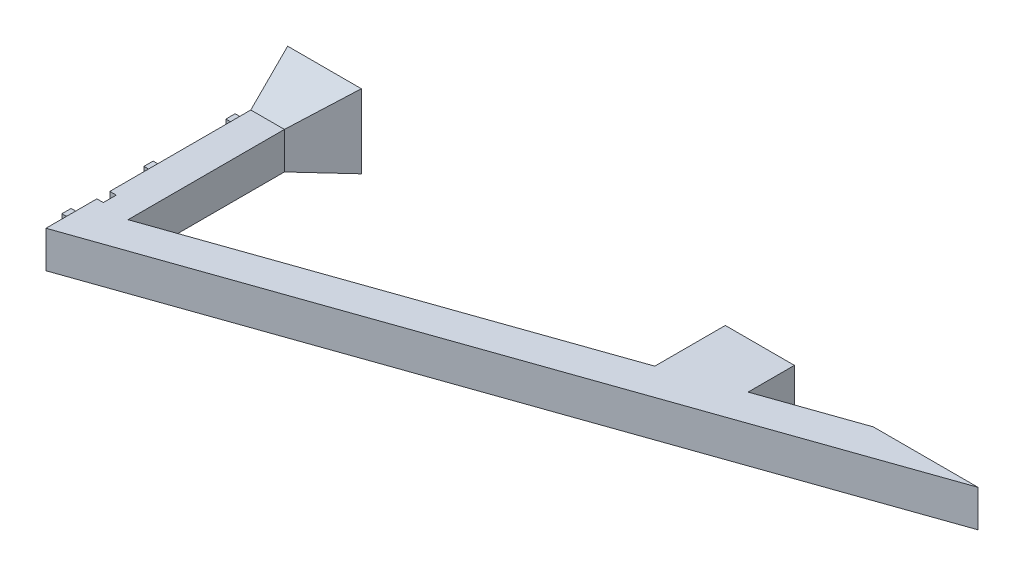
ISO-10303-21;
HEADER;
FILE_DESCRIPTION(('STEP AP214'),'2;1');
FILE_NAME('part.step','',(''),(''),'','','');
FILE_SCHEMA(('AUTOMOTIVE_DESIGN { 1 0 10303 214 1 1 1 1 }'));
ENDSEC;
DATA;
#1=APPLICATION_CONTEXT('core data for automotive mechanical design processes');
#2=APPLICATION_PROTOCOL_DEFINITION('international standard','automotive_design',2000,#1);
#3=PRODUCT_CONTEXT('',#1,'mechanical');
#4=PRODUCT('Part','Part','',(#3));
#5=PRODUCT_RELATED_PRODUCT_CATEGORY('part','',(#4));
#6=PRODUCT_DEFINITION_FORMATION('','',#4);
#7=PRODUCT_DEFINITION_CONTEXT('part definition',#1,'design');
#8=PRODUCT_DEFINITION('design','',#6,#7);
#9=PRODUCT_DEFINITION_SHAPE('','',#8);
#10=(LENGTH_UNIT() NAMED_UNIT(*) SI_UNIT(.MILLI.,.METRE.));
#11=(NAMED_UNIT(*) PLANE_ANGLE_UNIT() SI_UNIT($,.RADIAN.));
#12=(NAMED_UNIT(*) SI_UNIT($,.STERADIAN.) SOLID_ANGLE_UNIT());
#13=UNCERTAINTY_MEASURE_WITH_UNIT(LENGTH_MEASURE(1.E-05),#10,'distance_accuracy_value','');
#14=(GEOMETRIC_REPRESENTATION_CONTEXT(3) GLOBAL_UNCERTAINTY_ASSIGNED_CONTEXT((#13)) GLOBAL_UNIT_ASSIGNED_CONTEXT((#10,
#11,#12)) REPRESENTATION_CONTEXT('',''));
#15=CARTESIAN_POINT('',(0.,0.,0.));
#16=DIRECTION('',(0.,0.,1.));
#17=DIRECTION('',(1.,0.,0.));
#18=AXIS2_PLACEMENT_3D('',#15,#16,#17);
#19=CARTESIAN_POINT('',(7.3,8.,44.9487293378726));
#20=DIRECTION('',(-1.,0.,0.));
#21=DIRECTION('',(0.,0.,1.));
#22=AXIS2_PLACEMENT_3D('',#19,#20,#21);
#23=PLANE('',#22);
#24=DIRECTION('',(0.,0.,-1.));
#25=VECTOR('',#24,1.);
#26=CARTESIAN_POINT('',(7.3,8.,44.9487293378726));
#27=LINE('',#26,#25);
#28=CARTESIAN_POINT('',(7.3,8.,3.));
#29=VERTEX_POINT('',#28);
#30=CARTESIAN_POINT('',(7.3,8.,0.));
#31=VERTEX_POINT('',#30);
#32=EDGE_CURVE('E416',#29,#31,#27,.T.);
#33=ORIENTED_EDGE('',*,*,#32,.F.);
#34=DIRECTION('',(0.,-1.,0.));
#35=VECTOR('',#34,1.);
#36=CARTESIAN_POINT('',(7.3,8.,3.));
#37=LINE('',#36,#35);
#38=CARTESIAN_POINT('',(7.3,0.,3.));
#39=VERTEX_POINT('',#38);
#40=EDGE_CURVE('E266',#29,#39,#37,.T.);
#41=ORIENTED_EDGE('',*,*,#40,.T.);
#42=DIRECTION('',(0.,0.,-1.));
#43=VECTOR('',#42,1.);
#44=CARTESIAN_POINT('',(7.3,0.,44.9487293378726));
#45=LINE('',#44,#43);
#46=CARTESIAN_POINT('',(7.3,0.,0.));
#47=VERTEX_POINT('',#46);
#48=EDGE_CURVE('E255',#39,#47,#45,.T.);
#49=ORIENTED_EDGE('',*,*,#48,.T.);
#50=DIRECTION('',(0.,-1.,0.));
#51=VECTOR('',#50,1.);
#52=CARTESIAN_POINT('',(7.3,8.,0.));
#53=LINE('',#52,#51);
#54=EDGE_CURVE('E420',#31,#47,#53,.T.);
#55=ORIENTED_EDGE('',*,*,#54,.F.);
#56=EDGE_LOOP('',(#33,#41,#49,#55));
#57=FACE_BOUND('',#56,.T.);
#58=ADVANCED_FACE('F33',(#57),#23,.F.);
#59=CARTESIAN_POINT('',(0.,8.,0.));
#60=DIRECTION('',(0.,1.,0.));
#61=DIRECTION('',(0.,0.,1.));
#62=AXIS2_PLACEMENT_3D('',#59,#60,#61);
#63=PLANE('',#62);
#64=DIRECTION('',(-1.,0.,0.));
#65=VECTOR('',#64,1.);
#66=CARTESIAN_POINT('',(0.,8.,3.));
#67=LINE('',#66,#65);
#68=CARTESIAN_POINT('',(0.,8.,3.));
#69=VERTEX_POINT('',#68);
#70=EDGE_CURVE('E52',#29,#69,#67,.T.);
#71=ORIENTED_EDGE('',*,*,#70,.F.);
#72=ORIENTED_EDGE('',*,*,#32,.T.);
#73=DIRECTION('',(-1.,0.,0.));
#74=VECTOR('',#73,1.);
#75=CARTESIAN_POINT('',(7.3,8.,0.));
#76=LINE('',#75,#74);
#77=CARTESIAN_POINT('',(0.,8.,0.));
#78=VERTEX_POINT('',#77);
#79=EDGE_CURVE('E396',#31,#78,#76,.T.);
#80=ORIENTED_EDGE('',*,*,#79,.T.);
#81=DIRECTION('',(0.,0.,1.));
#82=VECTOR('',#81,1.);
#83=CARTESIAN_POINT('',(0.,8.,0.));
#84=LINE('',#83,#82);
#85=EDGE_CURVE('E48',#78,#69,#84,.T.);
#86=ORIENTED_EDGE('',*,*,#85,.T.);
#87=EDGE_LOOP('',(#71,#72,#80,#86));
#88=FACE_BOUND('',#87,.T.);
#89=ADVANCED_FACE('F520',(#88),#63,.T.);
#90=CARTESIAN_POINT('',(0.,8.,0.));
#91=DIRECTION('',(1.,0.,0.));
#92=DIRECTION('',(0.,0.,-1.));
#93=AXIS2_PLACEMENT_3D('',#90,#91,#92);
#94=PLANE('',#93);
#95=DIRECTION('',(0.,-1.,0.));
#96=VECTOR('',#95,1.);
#97=CARTESIAN_POINT('',(0.,5.,10.4));
#98=LINE('',#97,#96);
#99=CARTESIAN_POINT('',(0.,5.,10.4));
#100=VERTEX_POINT('',#99);
#101=CARTESIAN_POINT('',(0.,3.,10.4));
#102=VERTEX_POINT('',#101);
#103=EDGE_CURVE('E334',#100,#102,#98,.T.);
#104=ORIENTED_EDGE('',*,*,#103,.F.);
#105=DIRECTION('',(0.,0.,-1.));
#106=VECTOR('',#105,1.);
#107=CARTESIAN_POINT('',(0.,5.,10.4));
#108=LINE('',#107,#106);
#109=CARTESIAN_POINT('',(0.,5.,12.4));
#110=VERTEX_POINT('',#109);
#111=EDGE_CURVE('E339',#110,#100,#108,.T.);
#112=ORIENTED_EDGE('',*,*,#111,.F.);
#113=DIRECTION('',(0.,1.,0.));
#114=VECTOR('',#113,1.);
#115=CARTESIAN_POINT('',(0.,5.,12.4));
#116=LINE('',#115,#114);
#117=CARTESIAN_POINT('',(0.,3.,12.4));
#118=VERTEX_POINT('',#117);
#119=EDGE_CURVE('E350',#118,#110,#116,.T.);
#120=ORIENTED_EDGE('',*,*,#119,.F.);
#121=DIRECTION('',(0.,0.,1.));
#122=VECTOR('',#121,1.);
#123=CARTESIAN_POINT('',(0.,3.,10.4));
#124=LINE('',#123,#122);
#125=EDGE_CURVE('E348',#102,#118,#124,.T.);
#126=ORIENTED_EDGE('',*,*,#125,.F.);
#127=EDGE_LOOP('',(#104,#112,#120,#126));
#128=FACE_BOUND('',#127,.T.);
#129=DIRECTION('',(0.,-1.,0.));
#130=VECTOR('',#129,1.);
#131=CARTESIAN_POINT('',(0.,5.,28.2));
#132=LINE('',#131,#130);
#133=CARTESIAN_POINT('',(0.,5.,28.2));
#134=VERTEX_POINT('',#133);
#135=CARTESIAN_POINT('',(0.,3.,28.2));
#136=VERTEX_POINT('',#135);
#137=EDGE_CURVE('E301',#134,#136,#132,.T.);
#138=ORIENTED_EDGE('',*,*,#137,.F.);
#139=DIRECTION('',(0.,0.,-1.));
#140=VECTOR('',#139,1.);
#141=CARTESIAN_POINT('',(0.,5.,28.2));
#142=LINE('',#141,#140);
#143=CARTESIAN_POINT('',(0.,5.,30.2));
#144=VERTEX_POINT('',#143);
#145=EDGE_CURVE('E306',#144,#134,#142,.T.);
#146=ORIENTED_EDGE('',*,*,#145,.F.);
#147=DIRECTION('',(0.,1.,0.));
#148=VECTOR('',#147,1.);
#149=CARTESIAN_POINT('',(0.,5.,30.2));
#150=LINE('',#149,#148);
#151=CARTESIAN_POINT('',(0.,3.,30.2));
#152=VERTEX_POINT('',#151);
#153=EDGE_CURVE('E318',#152,#144,#150,.T.);
#154=ORIENTED_EDGE('',*,*,#153,.F.);
#155=DIRECTION('',(0.,0.,1.));
#156=VECTOR('',#155,1.);
#157=CARTESIAN_POINT('',(0.,3.,28.2));
#158=LINE('',#157,#156);
#159=EDGE_CURVE('E315',#136,#152,#158,.T.);
#160=ORIENTED_EDGE('',*,*,#159,.F.);
#161=EDGE_LOOP('',(#138,#146,#154,#160));
#162=FACE_BOUND('',#161,.T.);
#163=CARTESIAN_POINT('',(0.,8.,11.));
#164=VERTEX_POINT('',#163);
#165=CARTESIAN_POINT('',(0.,8.,41.6));
#166=VERTEX_POINT('',#165);
#167=EDGE_CURVE('E402',#164,#166,#84,.T.);
#168=ORIENTED_EDGE('',*,*,#167,.F.);
#169=DIRECTION('',(0.,-0.707106781186548,0.707106781186548));
#170=VECTOR('',#169,1.);
#171=CARTESIAN_POINT('',(0.,8.,11.));
#172=LINE('',#171,#170);
#173=CARTESIAN_POINT('',(0.,16.,3.));
#174=VERTEX_POINT('',#173);
#175=EDGE_CURVE('E240',#174,#164,#172,.T.);
#176=ORIENTED_EDGE('',*,*,#175,.F.);
#177=DIRECTION('',(0.,1.,0.));
#178=VECTOR('',#177,1.);
#179=CARTESIAN_POINT('',(0.,0.,3.));
#180=LINE('',#179,#178);
#181=EDGE_CURVE('E250',#69,#174,#180,.T.);
#182=ORIENTED_EDGE('',*,*,#181,.F.);
#183=ORIENTED_EDGE('',*,*,#85,.F.);
#184=DIRECTION('',(0.,-1.,0.));
#185=VECTOR('',#184,1.);
#186=CARTESIAN_POINT('',(0.,8.,0.));
#187=LINE('',#186,#185);
#188=CARTESIAN_POINT('',(0.,0.,0.));
#189=VERTEX_POINT('',#188);
#190=EDGE_CURVE('E41',#78,#189,#187,.T.);
#191=ORIENTED_EDGE('',*,*,#190,.T.);
#192=DIRECTION('',(0.,0.,1.));
#193=VECTOR('',#192,1.);
#194=CARTESIAN_POINT('',(0.,0.,0.));
#195=LINE('',#194,#193);
#196=CARTESIAN_POINT('',(0.,0.,55.45));
#197=VERTEX_POINT('',#196);
#198=EDGE_CURVE('E423',#189,#197,#195,.T.);
#199=ORIENTED_EDGE('',*,*,#198,.T.);
#200=DIRECTION('',(0.,-1.,0.));
#201=VECTOR('',#200,1.);
#202=CARTESIAN_POINT('',(0.,8.,55.45));
#203=LINE('',#202,#201);
#204=CARTESIAN_POINT('',(0.,8.,55.45));
#205=VERTEX_POINT('',#204);
#206=EDGE_CURVE('E463',#205,#197,#203,.T.);
#207=ORIENTED_EDGE('',*,*,#206,.F.);
#208=CARTESIAN_POINT('',(0.,8.,44.4));
#209=VERTEX_POINT('',#208);
#210=EDGE_CURVE('E398',#209,#205,#84,.T.);
#211=ORIENTED_EDGE('',*,*,#210,.F.);
#212=DIRECTION('',(0.,1.,0.));
#213=VECTOR('',#212,1.);
#214=CARTESIAN_POINT('',(0.,3.6,44.4));
#215=LINE('',#214,#213);
#216=CARTESIAN_POINT('',(0.,3.6,44.4));
#217=VERTEX_POINT('',#216);
#218=EDGE_CURVE('E379',#217,#209,#215,.T.);
#219=ORIENTED_EDGE('',*,*,#218,.F.);
#220=DIRECTION('',(0.,0.,1.));
#221=VECTOR('',#220,1.);
#222=CARTESIAN_POINT('',(0.,3.6,41.6));
#223=LINE('',#222,#221);
#224=CARTESIAN_POINT('',(0.,3.6,41.6));
#225=VERTEX_POINT('',#224);
#226=EDGE_CURVE('E366',#225,#217,#223,.T.);
#227=ORIENTED_EDGE('',*,*,#226,.F.);
#228=DIRECTION('',(0.,1.,0.));
#229=VECTOR('',#228,1.);
#230=CARTESIAN_POINT('',(0.,3.6,41.6));
#231=LINE('',#230,#229);
#232=EDGE_CURVE('E387',#225,#166,#231,.T.);
#233=ORIENTED_EDGE('',*,*,#232,.T.);
#234=EDGE_LOOP('',(#168,#176,#182,#183,#191,#199,#207,#211,#219,#227,#233));
#235=FACE_BOUND('',#234,.T.);
#236=DIRECTION('',(0.,-1.,0.));
#237=VECTOR('',#236,1.);
#238=CARTESIAN_POINT('',(0.,5.,46.));
#239=LINE('',#238,#237);
#240=CARTESIAN_POINT('',(0.,5.,46.));
#241=VERTEX_POINT('',#240);
#242=CARTESIAN_POINT('',(0.,3.,46.));
#243=VERTEX_POINT('',#242);
#244=EDGE_CURVE('E268',#241,#243,#239,.T.);
#245=ORIENTED_EDGE('',*,*,#244,.F.);
#246=DIRECTION('',(0.,0.,-1.));
#247=VECTOR('',#246,1.);
#248=CARTESIAN_POINT('',(0.,5.,46.));
#249=LINE('',#248,#247);
#250=CARTESIAN_POINT('',(0.,5.,48.));
#251=VERTEX_POINT('',#250);
#252=EDGE_CURVE('E273',#251,#241,#249,.T.);
#253=ORIENTED_EDGE('',*,*,#252,.F.);
#254=DIRECTION('',(0.,1.,0.));
#255=VECTOR('',#254,1.);
#256=CARTESIAN_POINT('',(0.,5.,48.));
#257=LINE('',#256,#255);
#258=CARTESIAN_POINT('',(0.,3.,48.));
#259=VERTEX_POINT('',#258);
#260=EDGE_CURVE('E285',#259,#251,#257,.T.);
#261=ORIENTED_EDGE('',*,*,#260,.F.);
#262=DIRECTION('',(0.,0.,1.));
#263=VECTOR('',#262,1.);
#264=CARTESIAN_POINT('',(0.,3.,46.));
#265=LINE('',#264,#263);
#266=EDGE_CURVE('E282',#243,#259,#265,.T.);
#267=ORIENTED_EDGE('',*,*,#266,.F.);
#268=EDGE_LOOP('',(#245,#253,#261,#267));
#269=FACE_BOUND('',#268,.T.);
#270=ADVANCED_FACE('F469',(#128,#162,#235,#269),#94,.F.);
#271=CARTESIAN_POINT('',(7.3,8.,0.));
#272=DIRECTION('',(0.,0.,1.));
#273=DIRECTION('',(1.,0.,0.));
#274=AXIS2_PLACEMENT_3D('',#271,#272,#273);
#275=PLANE('',#274);
#276=DIRECTION('',(-1.,0.,0.));
#277=VECTOR('',#276,1.);
#278=CARTESIAN_POINT('',(7.3,0.,0.));
#279=LINE('',#278,#277);
#280=EDGE_CURVE('E390',#47,#189,#279,.T.);
#281=ORIENTED_EDGE('',*,*,#280,.T.);
#282=ORIENTED_EDGE('',*,*,#190,.F.);
#283=ORIENTED_EDGE('',*,*,#79,.F.);
#284=ORIENTED_EDGE('',*,*,#54,.T.);
#285=EDGE_LOOP('',(#281,#282,#283,#284));
#286=FACE_BOUND('',#285,.T.);
#287=ADVANCED_FACE('F35',(#286),#275,.F.);
#288=CARTESIAN_POINT('',(0.,8.,55.45));
#289=DIRECTION('',(-0.330364452876395,0.,-0.943853446397098));
#290=DIRECTION('',(-0.943853446397098,0.,0.330364452876395));
#291=AXIS2_PLACEMENT_3D('',#288,#289,#290);
#292=PLANE('',#291);
#293=DIRECTION('',(0.943853446397098,0.,-0.330364452876395));
#294=VECTOR('',#293,1.);
#295=CARTESIAN_POINT('',(0.,0.,55.45));
#296=LINE('',#295,#294);
#297=CARTESIAN_POINT('',(149.85,0.,2.99999999999999));
#298=VERTEX_POINT('',#297);
#299=EDGE_CURVE('E425',#197,#298,#296,.T.);
#300=ORIENTED_EDGE('',*,*,#299,.T.);
#301=DIRECTION('',(0.,-1.,0.));
#302=VECTOR('',#301,1.);
#303=CARTESIAN_POINT('',(149.85,8.,2.99999999999999));
#304=LINE('',#303,#302);
#305=CARTESIAN_POINT('',(149.85,8.,2.99999999999999));
#306=VERTEX_POINT('',#305);
#307=EDGE_CURVE('E460',#306,#298,#304,.T.);
#308=ORIENTED_EDGE('',*,*,#307,.F.);
#309=DIRECTION('',(0.943853446397098,0.,-0.330364452876395));
#310=VECTOR('',#309,1.);
#311=CARTESIAN_POINT('',(0.,8.,55.45));
#312=LINE('',#311,#310);
#313=EDGE_CURVE('E401',#205,#306,#312,.T.);
#314=ORIENTED_EDGE('',*,*,#313,.F.);
#315=ORIENTED_EDGE('',*,*,#206,.T.);
#316=EDGE_LOOP('',(#300,#308,#314,#315));
#317=FACE_BOUND('',#316,.T.);
#318=ADVANCED_FACE('F481',(#317),#292,.F.);
#319=CARTESIAN_POINT('',(149.85,8.,2.99999999999999));
#320=DIRECTION('',(0.,0.,1.));
#321=DIRECTION('',(1.,0.,0.));
#322=AXIS2_PLACEMENT_3D('',#319,#320,#321);
#323=PLANE('',#322);
#324=DIRECTION('',(-1.,0.,0.));
#325=VECTOR('',#324,1.);
#326=CARTESIAN_POINT('',(149.85,0.,2.99999999999999));
#327=LINE('',#326,#325);
#328=CARTESIAN_POINT('',(127.147799643093,0.,3.));
#329=VERTEX_POINT('',#328);
#330=EDGE_CURVE('E427',#298,#329,#327,.T.);
#331=ORIENTED_EDGE('',*,*,#330,.T.);
#332=DIRECTION('',(0.,-1.,0.));
#333=VECTOR('',#332,1.);
#334=CARTESIAN_POINT('',(127.147799643093,8.,3.));
#335=LINE('',#334,#333);
#336=CARTESIAN_POINT('',(127.147799643093,8.,3.));
#337=VERTEX_POINT('',#336);
#338=EDGE_CURVE('E457',#337,#329,#335,.T.);
#339=ORIENTED_EDGE('',*,*,#338,.F.);
#340=DIRECTION('',(-1.,0.,0.));
#341=VECTOR('',#340,1.);
#342=CARTESIAN_POINT('',(149.85,8.,2.99999999999999));
#343=LINE('',#342,#341);
#344=EDGE_CURVE('E404',#306,#337,#343,.T.);
#345=ORIENTED_EDGE('',*,*,#344,.F.);
#346=ORIENTED_EDGE('',*,*,#307,.T.);
#347=EDGE_LOOP('',(#331,#339,#345,#346));
#348=FACE_BOUND('',#347,.T.);
#349=ADVANCED_FACE('F485',(#348),#323,.F.);
#350=CARTESIAN_POINT('',(127.147799643093,8.,3.));
#351=DIRECTION('',(0.330364452876395,0.,0.943853446397098));
#352=DIRECTION('',(0.943853446397098,0.,-0.330364452876395));
#353=AXIS2_PLACEMENT_3D('',#350,#351,#352);
#354=PLANE('',#353);
#355=DIRECTION('',(-0.943853446397098,0.,0.330364452876395));
#356=VECTOR('',#355,1.);
#357=CARTESIAN_POINT('',(127.147799643093,0.,3.));
#358=LINE('',#357,#356);
#359=CARTESIAN_POINT('',(107.,0.,10.0520660078759));
#360=VERTEX_POINT('',#359);
#361=EDGE_CURVE('E429',#329,#360,#358,.T.);
#362=ORIENTED_EDGE('',*,*,#361,.T.);
#363=DIRECTION('',(0.,-1.,0.));
#364=VECTOR('',#363,1.);
#365=CARTESIAN_POINT('',(107.,8.,10.0520660078759));
#366=LINE('',#365,#364);
#367=CARTESIAN_POINT('',(107.,8.,10.0520660078759));
#368=VERTEX_POINT('',#367);
#369=EDGE_CURVE('E454',#368,#360,#366,.T.);
#370=ORIENTED_EDGE('',*,*,#369,.F.);
#371=DIRECTION('',(-0.943853446397098,0.,0.330364452876395));
#372=VECTOR('',#371,1.);
#373=CARTESIAN_POINT('',(127.147799643093,8.,3.));
#374=LINE('',#373,#372);
#375=EDGE_CURVE('E406',#337,#368,#374,.T.);
#376=ORIENTED_EDGE('',*,*,#375,.F.);
#377=ORIENTED_EDGE('',*,*,#338,.T.);
#378=EDGE_LOOP('',(#362,#370,#376,#377));
#379=FACE_BOUND('',#378,.T.);
#380=ADVANCED_FACE('F557',(#379),#354,.F.);
#381=CARTESIAN_POINT('',(107.,8.,10.0520660078759));
#382=DIRECTION('',(-1.,0.,0.));
#383=DIRECTION('',(0.,0.,1.));
#384=AXIS2_PLACEMENT_3D('',#381,#382,#383);
#385=PLANE('',#384);
#386=DIRECTION('',(0.,0.,-1.));
#387=VECTOR('',#386,1.);
#388=CARTESIAN_POINT('',(107.,0.,10.0520660078759));
#389=LINE('',#388,#387);
#390=CARTESIAN_POINT('',(107.,0.,0.));
#391=VERTEX_POINT('',#390);
#392=EDGE_CURVE('E431',#360,#391,#389,.T.);
#393=ORIENTED_EDGE('',*,*,#392,.T.);
#394=DIRECTION('',(0.,-1.,0.));
#395=VECTOR('',#394,1.);
#396=CARTESIAN_POINT('',(107.,8.,0.));
#397=LINE('',#396,#395);
#398=CARTESIAN_POINT('',(107.,8.,0.));
#399=VERTEX_POINT('',#398);
#400=EDGE_CURVE('E451',#399,#391,#397,.T.);
#401=ORIENTED_EDGE('',*,*,#400,.F.);
#402=DIRECTION('',(0.,0.,-1.));
#403=VECTOR('',#402,1.);
#404=CARTESIAN_POINT('',(107.,8.,10.0520660078759));
#405=LINE('',#404,#403);
#406=EDGE_CURVE('E408',#368,#399,#405,.T.);
#407=ORIENTED_EDGE('',*,*,#406,.F.);
#408=ORIENTED_EDGE('',*,*,#369,.T.);
#409=EDGE_LOOP('',(#393,#401,#407,#408));
#410=FACE_BOUND('',#409,.T.);
#411=ADVANCED_FACE('F554',(#410),#385,.F.);
#412=CARTESIAN_POINT('',(107.,8.,0.));
#413=DIRECTION('',(0.,0.,1.));
#414=DIRECTION('',(1.,0.,0.));
#415=AXIS2_PLACEMENT_3D('',#412,#413,#414);
#416=PLANE('',#415);
#417=DIRECTION('',(-1.,0.,0.));
#418=VECTOR('',#417,1.);
#419=CARTESIAN_POINT('',(107.,0.,0.));
#420=LINE('',#419,#418);
#421=CARTESIAN_POINT('',(92.,0.,0.));
#422=VERTEX_POINT('',#421);
#423=EDGE_CURVE('E433',#391,#422,#420,.T.);
#424=ORIENTED_EDGE('',*,*,#423,.T.);
#425=DIRECTION('',(0.,-1.,0.));
#426=VECTOR('',#425,1.);
#427=CARTESIAN_POINT('',(92.,8.,0.));
#428=LINE('',#427,#426);
#429=CARTESIAN_POINT('',(92.,8.,0.));
#430=VERTEX_POINT('',#429);
#431=EDGE_CURVE('E448',#430,#422,#428,.T.);
#432=ORIENTED_EDGE('',*,*,#431,.F.);
#433=DIRECTION('',(-1.,0.,0.));
#434=VECTOR('',#433,1.);
#435=CARTESIAN_POINT('',(107.,8.,0.));
#436=LINE('',#435,#434);
#437=EDGE_CURVE('E410',#399,#430,#436,.T.);
#438=ORIENTED_EDGE('',*,*,#437,.F.);
#439=ORIENTED_EDGE('',*,*,#400,.T.);
#440=EDGE_LOOP('',(#424,#432,#438,#439));
#441=FACE_BOUND('',#440,.T.);
#442=ADVANCED_FACE('F550',(#441),#416,.F.);
#443=CARTESIAN_POINT('',(92.,8.,0.));
#444=DIRECTION('',(1.,0.,0.));
#445=DIRECTION('',(0.,0.,-1.));
#446=AXIS2_PLACEMENT_3D('',#443,#444,#445);
#447=PLANE('',#446);
#448=DIRECTION('',(0.,0.,1.));
#449=VECTOR('',#448,1.);
#450=CARTESIAN_POINT('',(92.,0.,0.));
#451=LINE('',#450,#449);
#452=CARTESIAN_POINT('',(92.,0.,15.3023162581262));
#453=VERTEX_POINT('',#452);
#454=EDGE_CURVE('E435',#422,#453,#451,.T.);
#455=ORIENTED_EDGE('',*,*,#454,.T.);
#456=DIRECTION('',(0.,-1.,0.));
#457=VECTOR('',#456,1.);
#458=CARTESIAN_POINT('',(92.,8.,15.3023162581262));
#459=LINE('',#458,#457);
#460=CARTESIAN_POINT('',(92.,8.,15.3023162581262));
#461=VERTEX_POINT('',#460);
#462=EDGE_CURVE('E445',#461,#453,#459,.T.);
#463=ORIENTED_EDGE('',*,*,#462,.F.);
#464=DIRECTION('',(0.,0.,1.));
#465=VECTOR('',#464,1.);
#466=CARTESIAN_POINT('',(92.,8.,0.));
#467=LINE('',#466,#465);
#468=EDGE_CURVE('E412',#430,#461,#467,.T.);
#469=ORIENTED_EDGE('',*,*,#468,.F.);
#470=ORIENTED_EDGE('',*,*,#431,.T.);
#471=EDGE_LOOP('',(#455,#463,#469,#470));
#472=FACE_BOUND('',#471,.T.);
#473=ADVANCED_FACE('F536',(#472),#447,.F.);
#474=CARTESIAN_POINT('',(92.,8.,15.3023162581262));
#475=DIRECTION('',(0.330364452876395,0.,0.943853446397098));
#476=DIRECTION('',(0.943853446397098,0.,-0.330364452876395));
#477=AXIS2_PLACEMENT_3D('',#474,#475,#476);
#478=PLANE('',#477);
#479=DIRECTION('',(-0.943853446397098,0.,0.330364452876395));
#480=VECTOR('',#479,1.);
#481=CARTESIAN_POINT('',(92.,0.,15.3023162581262));
#482=LINE('',#481,#480);
#483=CARTESIAN_POINT('',(7.3,0.,44.9487293378726));
#484=VERTEX_POINT('',#483);
#485=EDGE_CURVE('E437',#453,#484,#482,.T.);
#486=ORIENTED_EDGE('',*,*,#485,.T.);
#487=DIRECTION('',(0.,-1.,0.));
#488=VECTOR('',#487,1.);
#489=CARTESIAN_POINT('',(7.3,8.,44.9487293378726));
#490=LINE('',#489,#488);
#491=CARTESIAN_POINT('',(7.3,8.,44.9487293378726));
#492=VERTEX_POINT('',#491);
#493=EDGE_CURVE('E442',#492,#484,#490,.T.);
#494=ORIENTED_EDGE('',*,*,#493,.F.);
#495=DIRECTION('',(-0.943853446397098,0.,0.330364452876395));
#496=VECTOR('',#495,1.);
#497=CARTESIAN_POINT('',(92.,8.,15.3023162581262));
#498=LINE('',#497,#496);
#499=EDGE_CURVE('E414',#461,#492,#498,.T.);
#500=ORIENTED_EDGE('',*,*,#499,.F.);
#501=ORIENTED_EDGE('',*,*,#462,.T.);
#502=EDGE_LOOP('',(#486,#494,#500,#501));
#503=FACE_BOUND('',#502,.T.);
#504=ADVANCED_FACE('F530',(#503),#478,.F.);
#505=CARTESIAN_POINT('',(7.3,0.,11.));
#506=VERTEX_POINT('',#505);
#507=EDGE_CURVE('E399',#484,#506,#45,.T.);
#508=ORIENTED_EDGE('',*,*,#507,.T.);
#509=DIRECTION('',(0.,1.,0.));
#510=VECTOR('',#509,1.);
#511=CARTESIAN_POINT('',(7.3,8.,11.));
#512=LINE('',#511,#510);
#513=CARTESIAN_POINT('',(7.3,8.00000000000006,11.));
#514=VERTEX_POINT('',#513);
#515=EDGE_CURVE('E235',#506,#514,#512,.T.);
#516=ORIENTED_EDGE('',*,*,#515,.T.);
#517=EDGE_CURVE('E417',#492,#514,#27,.T.);
#518=ORIENTED_EDGE('',*,*,#517,.F.);
#519=ORIENTED_EDGE('',*,*,#493,.T.);
#520=EDGE_LOOP('',(#508,#516,#518,#519));
#521=FACE_BOUND('',#520,.T.);
#522=ADVANCED_FACE('F523',(#521),#23,.F.);
#523=ORIENTED_EDGE('',*,*,#313,.T.);
#524=ORIENTED_EDGE('',*,*,#344,.T.);
#525=ORIENTED_EDGE('',*,*,#375,.T.);
#526=ORIENTED_EDGE('',*,*,#406,.T.);
#527=ORIENTED_EDGE('',*,*,#437,.T.);
#528=ORIENTED_EDGE('',*,*,#468,.T.);
#529=ORIENTED_EDGE('',*,*,#499,.T.);
#530=ORIENTED_EDGE('',*,*,#517,.T.);
#531=DIRECTION('',(1.,0.,0.));
#532=VECTOR('',#531,1.);
#533=CARTESIAN_POINT('',(0.,8.,11.));
#534=LINE('',#533,#532);
#535=EDGE_CURVE('E260',#164,#514,#534,.T.);
#536=ORIENTED_EDGE('',*,*,#535,.F.);
#537=ORIENTED_EDGE('',*,*,#167,.T.);
#538=DIRECTION('',(-1.,0.,0.));
#539=VECTOR('',#538,1.);
#540=CARTESIAN_POINT('',(0.,8.,41.6));
#541=LINE('',#540,#539);
#542=CARTESIAN_POINT('',(1.4,8.,41.6));
#543=VERTEX_POINT('',#542);
#544=EDGE_CURVE('E370',#543,#166,#541,.T.);
#545=ORIENTED_EDGE('',*,*,#544,.F.);
#546=DIRECTION('',(0.,0.,-1.));
#547=VECTOR('',#546,1.);
#548=CARTESIAN_POINT('',(1.4,8.,41.6));
#549=LINE('',#548,#547);
#550=CARTESIAN_POINT('',(1.4,8.,44.4));
#551=VERTEX_POINT('',#550);
#552=EDGE_CURVE('E382',#551,#543,#549,.T.);
#553=ORIENTED_EDGE('',*,*,#552,.F.);
#554=DIRECTION('',(1.,0.,0.));
#555=VECTOR('',#554,1.);
#556=CARTESIAN_POINT('',(0.,8.,44.4));
#557=LINE('',#556,#555);
#558=EDGE_CURVE('E365',#209,#551,#557,.T.);
#559=ORIENTED_EDGE('',*,*,#558,.F.);
#560=ORIENTED_EDGE('',*,*,#210,.T.);
#561=EDGE_LOOP('',(#523,#524,#525,#526,#527,#528,#529,#530,#536,#537,#545,#553,#559,#560));
#562=FACE_BOUND('',#561,.T.);
#563=ADVANCED_FACE('F489',(#562),#63,.T.);
#564=CARTESIAN_POINT('',(0.,0.,0.));
#565=DIRECTION('',(0.,1.,0.));
#566=DIRECTION('',(0.,0.,1.));
#567=AXIS2_PLACEMENT_3D('',#564,#565,#566);
#568=PLANE('',#567);
#569=DIRECTION('',(-1.,0.,0.));
#570=VECTOR('',#569,1.);
#571=CARTESIAN_POINT('',(0.,0.,3.));
#572=LINE('',#571,#570);
#573=CARTESIAN_POINT('',(16.,0.,3.));
#574=VERTEX_POINT('',#573);
#575=EDGE_CURVE('E247',#574,#39,#572,.T.);
#576=ORIENTED_EDGE('',*,*,#575,.F.);
#577=DIRECTION('',(0.736099620693867,0.,-0.676873214431141));
#578=VECTOR('',#577,1.);
#579=CARTESIAN_POINT('',(16.,0.,3.));
#580=LINE('',#579,#578);
#581=EDGE_CURVE('E230',#506,#574,#580,.T.);
#582=ORIENTED_EDGE('',*,*,#581,.F.);
#583=ORIENTED_EDGE('',*,*,#507,.F.);
#584=ORIENTED_EDGE('',*,*,#485,.F.);
#585=ORIENTED_EDGE('',*,*,#454,.F.);
#586=ORIENTED_EDGE('',*,*,#423,.F.);
#587=ORIENTED_EDGE('',*,*,#392,.F.);
#588=ORIENTED_EDGE('',*,*,#361,.F.);
#589=ORIENTED_EDGE('',*,*,#330,.F.);
#590=ORIENTED_EDGE('',*,*,#299,.F.);
#591=ORIENTED_EDGE('',*,*,#198,.F.);
#592=ORIENTED_EDGE('',*,*,#280,.F.);
#593=ORIENTED_EDGE('',*,*,#48,.F.);
#594=EDGE_LOOP('',(#576,#582,#583,#584,#585,#586,#587,#588,#589,#590,#591,#592,#593));
#595=FACE_BOUND('',#594,.T.);
#596=ADVANCED_FACE('F253',(#595),#568,.F.);
#597=CARTESIAN_POINT('',(0.,3.6,41.6));
#598=DIRECTION('',(0.,0.,-1.));
#599=DIRECTION('',(-1.,0.,0.));
#600=AXIS2_PLACEMENT_3D('',#597,#598,#599);
#601=PLANE('',#600);
#602=ORIENTED_EDGE('',*,*,#544,.T.);
#603=ORIENTED_EDGE('',*,*,#232,.F.);
#604=DIRECTION('',(-1.,0.,0.));
#605=VECTOR('',#604,1.);
#606=CARTESIAN_POINT('',(0.,3.6,41.6));
#607=LINE('',#606,#605);
#608=CARTESIAN_POINT('',(1.4,3.6,41.6));
#609=VERTEX_POINT('',#608);
#610=EDGE_CURVE('E376',#609,#225,#607,.T.);
#611=ORIENTED_EDGE('',*,*,#610,.F.);
#612=DIRECTION('',(0.,1.,0.));
#613=VECTOR('',#612,1.);
#614=CARTESIAN_POINT('',(1.4,3.6,41.6));
#615=LINE('',#614,#613);
#616=EDGE_CURVE('E391',#609,#543,#615,.T.);
#617=ORIENTED_EDGE('',*,*,#616,.T.);
#618=EDGE_LOOP('',(#602,#603,#611,#617));
#619=FACE_BOUND('',#618,.T.);
#620=ADVANCED_FACE('F499',(#619),#601,.F.);
#621=CARTESIAN_POINT('',(1.4,3.6,41.6));
#622=DIRECTION('',(1.,0.,0.));
#623=DIRECTION('',(0.,0.,-1.));
#624=AXIS2_PLACEMENT_3D('',#621,#622,#623);
#625=PLANE('',#624);
#626=ORIENTED_EDGE('',*,*,#552,.T.);
#627=ORIENTED_EDGE('',*,*,#616,.F.);
#628=DIRECTION('',(0.,0.,-1.));
#629=VECTOR('',#628,1.);
#630=CARTESIAN_POINT('',(1.4,3.6,41.6));
#631=LINE('',#630,#629);
#632=CARTESIAN_POINT('',(1.4,3.6,44.4));
#633=VERTEX_POINT('',#632);
#634=EDGE_CURVE('E373',#633,#609,#631,.T.);
#635=ORIENTED_EDGE('',*,*,#634,.F.);
#636=DIRECTION('',(0.,1.,0.));
#637=VECTOR('',#636,1.);
#638=CARTESIAN_POINT('',(1.4,3.6,44.4));
#639=LINE('',#638,#637);
#640=EDGE_CURVE('E393',#633,#551,#639,.T.);
#641=ORIENTED_EDGE('',*,*,#640,.T.);
#642=EDGE_LOOP('',(#626,#627,#635,#641));
#643=FACE_BOUND('',#642,.T.);
#644=ADVANCED_FACE('F506',(#643),#625,.F.);
#645=CARTESIAN_POINT('',(0.,3.6,44.4));
#646=DIRECTION('',(0.,0.,1.));
#647=DIRECTION('',(1.,0.,0.));
#648=AXIS2_PLACEMENT_3D('',#645,#646,#647);
#649=PLANE('',#648);
#650=ORIENTED_EDGE('',*,*,#558,.T.);
#651=ORIENTED_EDGE('',*,*,#640,.F.);
#652=DIRECTION('',(1.,0.,0.));
#653=VECTOR('',#652,1.);
#654=CARTESIAN_POINT('',(0.,3.6,44.4));
#655=LINE('',#654,#653);
#656=EDGE_CURVE('E369',#217,#633,#655,.T.);
#657=ORIENTED_EDGE('',*,*,#656,.F.);
#658=ORIENTED_EDGE('',*,*,#218,.T.);
#659=EDGE_LOOP('',(#650,#651,#657,#658));
#660=FACE_BOUND('',#659,.T.);
#661=ADVANCED_FACE('F508',(#660),#649,.F.);
#662=CARTESIAN_POINT('',(0.,3.6,0.));
#663=DIRECTION('',(0.,1.,0.));
#664=DIRECTION('',(0.,0.,1.));
#665=AXIS2_PLACEMENT_3D('',#662,#663,#664);
#666=PLANE('',#665);
#667=ORIENTED_EDGE('',*,*,#226,.T.);
#668=ORIENTED_EDGE('',*,*,#656,.T.);
#669=ORIENTED_EDGE('',*,*,#634,.T.);
#670=ORIENTED_EDGE('',*,*,#610,.T.);
#671=EDGE_LOOP('',(#667,#668,#669,#670));
#672=FACE_BOUND('',#671,.T.);
#673=ADVANCED_FACE('F503',(#672),#666,.T.);
#674=CARTESIAN_POINT('',(-4.,5.,10.4));
#675=DIRECTION('',(0.,0.,1.));
#676=DIRECTION('',(1.,0.,0.));
#677=AXIS2_PLACEMENT_3D('',#674,#675,#676);
#678=PLANE('',#677);
#679=ORIENTED_EDGE('',*,*,#103,.T.);
#680=DIRECTION('',(1.,0.,0.));
#681=VECTOR('',#680,1.);
#682=CARTESIAN_POINT('',(-4.,3.,10.4));
#683=LINE('',#682,#681);
#684=CARTESIAN_POINT('',(-4.,3.,10.4));
#685=VERTEX_POINT('',#684);
#686=EDGE_CURVE('E362',#685,#102,#683,.T.);
#687=ORIENTED_EDGE('',*,*,#686,.F.);
#688=DIRECTION('',(0.,-1.,0.));
#689=VECTOR('',#688,1.);
#690=CARTESIAN_POINT('',(-4.,5.,10.4));
#691=LINE('',#690,#689);
#692=CARTESIAN_POINT('',(-4.,5.,10.4));
#693=VERTEX_POINT('',#692);
#694=EDGE_CURVE('E335',#693,#685,#691,.T.);
#695=ORIENTED_EDGE('',*,*,#694,.F.);
#696=DIRECTION('',(1.,0.,0.));
#697=VECTOR('',#696,1.);
#698=CARTESIAN_POINT('',(-4.,5.,10.4));
#699=LINE('',#698,#697);
#700=EDGE_CURVE('E345',#693,#100,#699,.T.);
#701=ORIENTED_EDGE('',*,*,#700,.T.);
#702=EDGE_LOOP('',(#679,#687,#695,#701));
#703=FACE_BOUND('',#702,.T.);
#704=ADVANCED_FACE('F515',(#703),#678,.F.);
#705=CARTESIAN_POINT('',(-4.,3.,10.4));
#706=DIRECTION('',(0.,1.,0.));
#707=DIRECTION('',(0.,0.,1.));
#708=AXIS2_PLACEMENT_3D('',#705,#706,#707);
#709=PLANE('',#708);
#710=ORIENTED_EDGE('',*,*,#125,.T.);
#711=DIRECTION('',(1.,0.,0.));
#712=VECTOR('',#711,1.);
#713=CARTESIAN_POINT('',(-4.,3.,12.4));
#714=LINE('',#713,#712);
#715=CARTESIAN_POINT('',(-4.,3.,12.4));
#716=VERTEX_POINT('',#715);
#717=EDGE_CURVE('E359',#716,#118,#714,.T.);
#718=ORIENTED_EDGE('',*,*,#717,.F.);
#719=DIRECTION('',(0.,0.,1.));
#720=VECTOR('',#719,1.);
#721=CARTESIAN_POINT('',(-4.,3.,10.4));
#722=LINE('',#721,#720);
#723=EDGE_CURVE('E338',#685,#716,#722,.T.);
#724=ORIENTED_EDGE('',*,*,#723,.F.);
#725=ORIENTED_EDGE('',*,*,#686,.T.);
#726=EDGE_LOOP('',(#710,#718,#724,#725));
#727=FACE_BOUND('',#726,.T.);
#728=ADVANCED_FACE('F614',(#727),#709,.F.);
#729=CARTESIAN_POINT('',(-4.,5.,12.4));
#730=DIRECTION('',(0.,0.,-1.));
#731=DIRECTION('',(0.,1.,0.));
#732=AXIS2_PLACEMENT_3D('',#729,#730,#731);
#733=PLANE('',#732);
#734=ORIENTED_EDGE('',*,*,#119,.T.);
#735=DIRECTION('',(1.,0.,0.));
#736=VECTOR('',#735,1.);
#737=CARTESIAN_POINT('',(-4.,5.,12.4));
#738=LINE('',#737,#736);
#739=CARTESIAN_POINT('',(-4.,5.,12.4));
#740=VERTEX_POINT('',#739);
#741=EDGE_CURVE('E356',#740,#110,#738,.T.);
#742=ORIENTED_EDGE('',*,*,#741,.F.);
#743=DIRECTION('',(0.,1.,0.));
#744=VECTOR('',#743,1.);
#745=CARTESIAN_POINT('',(-4.,5.,12.4));
#746=LINE('',#745,#744);
#747=EDGE_CURVE('E341',#716,#740,#746,.T.);
#748=ORIENTED_EDGE('',*,*,#747,.F.);
#749=ORIENTED_EDGE('',*,*,#717,.T.);
#750=EDGE_LOOP('',(#734,#742,#748,#749));
#751=FACE_BOUND('',#750,.T.);
#752=ADVANCED_FACE('F610',(#751),#733,.F.);
#753=CARTESIAN_POINT('',(-4.,5.,10.4));
#754=DIRECTION('',(0.,-1.,0.));
#755=DIRECTION('',(0.,0.,-1.));
#756=AXIS2_PLACEMENT_3D('',#753,#754,#755);
#757=PLANE('',#756);
#758=ORIENTED_EDGE('',*,*,#111,.T.);
#759=ORIENTED_EDGE('',*,*,#700,.F.);
#760=DIRECTION('',(0.,0.,-1.));
#761=VECTOR('',#760,1.);
#762=CARTESIAN_POINT('',(-4.,5.,10.4));
#763=LINE('',#762,#761);
#764=EDGE_CURVE('E343',#740,#693,#763,.T.);
#765=ORIENTED_EDGE('',*,*,#764,.F.);
#766=ORIENTED_EDGE('',*,*,#741,.T.);
#767=EDGE_LOOP('',(#758,#759,#765,#766));
#768=FACE_BOUND('',#767,.T.);
#769=ADVANCED_FACE('F606',(#768),#757,.F.);
#770=CARTESIAN_POINT('',(-4.,0.,0.));
#771=DIRECTION('',(-1.,0.,0.));
#772=DIRECTION('',(0.,0.,1.));
#773=AXIS2_PLACEMENT_3D('',#770,#771,#772);
#774=PLANE('',#773);
#775=ORIENTED_EDGE('',*,*,#694,.T.);
#776=ORIENTED_EDGE('',*,*,#723,.T.);
#777=ORIENTED_EDGE('',*,*,#747,.T.);
#778=ORIENTED_EDGE('',*,*,#764,.T.);
#779=EDGE_LOOP('',(#775,#776,#777,#778));
#780=FACE_BOUND('',#779,.T.);
#781=ADVANCED_FACE('F600',(#780),#774,.T.);
#782=CARTESIAN_POINT('',(-4.,5.,28.2));
#783=DIRECTION('',(0.,0.,1.));
#784=DIRECTION('',(1.,0.,0.));
#785=AXIS2_PLACEMENT_3D('',#782,#783,#784);
#786=PLANE('',#785);
#787=ORIENTED_EDGE('',*,*,#137,.T.);
#788=DIRECTION('',(1.,0.,0.));
#789=VECTOR('',#788,1.);
#790=CARTESIAN_POINT('',(-4.,3.,28.2));
#791=LINE('',#790,#789);
#792=CARTESIAN_POINT('',(-4.,3.,28.2));
#793=VERTEX_POINT('',#792);
#794=EDGE_CURVE('E331',#793,#136,#791,.T.);
#795=ORIENTED_EDGE('',*,*,#794,.F.);
#796=DIRECTION('',(0.,-1.,0.));
#797=VECTOR('',#796,1.);
#798=CARTESIAN_POINT('',(-4.,5.,28.2));
#799=LINE('',#798,#797);
#800=CARTESIAN_POINT('',(-4.,5.,28.2));
#801=VERTEX_POINT('',#800);
#802=EDGE_CURVE('E302',#801,#793,#799,.T.);
#803=ORIENTED_EDGE('',*,*,#802,.F.);
#804=DIRECTION('',(1.,0.,0.));
#805=VECTOR('',#804,1.);
#806=CARTESIAN_POINT('',(-4.,5.,28.2));
#807=LINE('',#806,#805);
#808=EDGE_CURVE('E312',#801,#134,#807,.T.);
#809=ORIENTED_EDGE('',*,*,#808,.T.);
#810=EDGE_LOOP('',(#787,#795,#803,#809));
#811=FACE_BOUND('',#810,.T.);
#812=ADVANCED_FACE('F584',(#811),#786,.F.);
#813=CARTESIAN_POINT('',(-4.,3.,28.2));
#814=DIRECTION('',(0.,1.,0.));
#815=DIRECTION('',(0.,0.,1.));
#816=AXIS2_PLACEMENT_3D('',#813,#814,#815);
#817=PLANE('',#816);
#818=ORIENTED_EDGE('',*,*,#159,.T.);
#819=DIRECTION('',(1.,0.,0.));
#820=VECTOR('',#819,1.);
#821=CARTESIAN_POINT('',(-4.,3.,30.2));
#822=LINE('',#821,#820);
#823=CARTESIAN_POINT('',(-4.,3.,30.2));
#824=VERTEX_POINT('',#823);
#825=EDGE_CURVE('E328',#824,#152,#822,.T.);
#826=ORIENTED_EDGE('',*,*,#825,.F.);
#827=DIRECTION('',(0.,0.,1.));
#828=VECTOR('',#827,1.);
#829=CARTESIAN_POINT('',(-4.,3.,28.2));
#830=LINE('',#829,#828);
#831=EDGE_CURVE('E305',#793,#824,#830,.T.);
#832=ORIENTED_EDGE('',*,*,#831,.F.);
#833=ORIENTED_EDGE('',*,*,#794,.T.);
#834=EDGE_LOOP('',(#818,#826,#832,#833));
#835=FACE_BOUND('',#834,.T.);
#836=ADVANCED_FACE('F592',(#835),#817,.F.);
#837=CARTESIAN_POINT('',(-4.,5.,30.2));
#838=DIRECTION('',(0.,0.,-1.));
#839=DIRECTION('',(-1.,0.,0.));
#840=AXIS2_PLACEMENT_3D('',#837,#838,#839);
#841=PLANE('',#840);
#842=ORIENTED_EDGE('',*,*,#153,.T.);
#843=DIRECTION('',(1.,0.,0.));
#844=VECTOR('',#843,1.);
#845=CARTESIAN_POINT('',(-4.,5.,30.2));
#846=LINE('',#845,#844);
#847=CARTESIAN_POINT('',(-4.,5.,30.2));
#848=VERTEX_POINT('',#847);
#849=EDGE_CURVE('E325',#848,#144,#846,.T.);
#850=ORIENTED_EDGE('',*,*,#849,.F.);
#851=DIRECTION('',(0.,1.,0.));
#852=VECTOR('',#851,1.);
#853=CARTESIAN_POINT('',(-4.,5.,30.2));
#854=LINE('',#853,#852);
#855=EDGE_CURVE('E308',#824,#848,#854,.T.);
#856=ORIENTED_EDGE('',*,*,#855,.F.);
#857=ORIENTED_EDGE('',*,*,#825,.T.);
#858=EDGE_LOOP('',(#842,#850,#856,#857));
#859=FACE_BOUND('',#858,.T.);
#860=ADVANCED_FACE('F590',(#859),#841,.F.);
#861=CARTESIAN_POINT('',(-4.,5.,28.2));
#862=DIRECTION('',(0.,-1.,0.));
#863=DIRECTION('',(0.,0.,-1.));
#864=AXIS2_PLACEMENT_3D('',#861,#862,#863);
#865=PLANE('',#864);
#866=ORIENTED_EDGE('',*,*,#145,.T.);
#867=ORIENTED_EDGE('',*,*,#808,.F.);
#868=DIRECTION('',(0.,0.,-1.));
#869=VECTOR('',#868,1.);
#870=CARTESIAN_POINT('',(-4.,5.,28.2));
#871=LINE('',#870,#869);
#872=EDGE_CURVE('E310',#848,#801,#871,.T.);
#873=ORIENTED_EDGE('',*,*,#872,.F.);
#874=ORIENTED_EDGE('',*,*,#849,.T.);
#875=EDGE_LOOP('',(#866,#867,#873,#874));
#876=FACE_BOUND('',#875,.T.);
#877=ADVANCED_FACE('F580',(#876),#865,.F.);
#878=CARTESIAN_POINT('',(-4.,0.,0.));
#879=DIRECTION('',(-1.,0.,0.));
#880=DIRECTION('',(0.,0.,1.));
#881=AXIS2_PLACEMENT_3D('',#878,#879,#880);
#882=PLANE('',#881);
#883=ORIENTED_EDGE('',*,*,#802,.T.);
#884=ORIENTED_EDGE('',*,*,#831,.T.);
#885=ORIENTED_EDGE('',*,*,#855,.T.);
#886=ORIENTED_EDGE('',*,*,#872,.T.);
#887=EDGE_LOOP('',(#883,#884,#885,#886));
#888=FACE_BOUND('',#887,.T.);
#889=ADVANCED_FACE('F586',(#888),#882,.T.);
#890=CARTESIAN_POINT('',(-4.,5.,46.));
#891=DIRECTION('',(0.,0.,1.));
#892=DIRECTION('',(1.,0.,0.));
#893=AXIS2_PLACEMENT_3D('',#890,#891,#892);
#894=PLANE('',#893);
#895=ORIENTED_EDGE('',*,*,#244,.T.);
#896=DIRECTION('',(1.,0.,0.));
#897=VECTOR('',#896,1.);
#898=CARTESIAN_POINT('',(-4.,3.,46.));
#899=LINE('',#898,#897);
#900=CARTESIAN_POINT('',(-4.,3.,46.));
#901=VERTEX_POINT('',#900);
#902=EDGE_CURVE('E298',#901,#243,#899,.T.);
#903=ORIENTED_EDGE('',*,*,#902,.F.);
#904=DIRECTION('',(0.,-1.,0.));
#905=VECTOR('',#904,1.);
#906=CARTESIAN_POINT('',(-4.,5.,46.));
#907=LINE('',#906,#905);
#908=CARTESIAN_POINT('',(-4.,5.,46.));
#909=VERTEX_POINT('',#908);
#910=EDGE_CURVE('E269',#909,#901,#907,.T.);
#911=ORIENTED_EDGE('',*,*,#910,.F.);
#912=DIRECTION('',(1.,0.,0.));
#913=VECTOR('',#912,1.);
#914=CARTESIAN_POINT('',(-4.,5.,46.));
#915=LINE('',#914,#913);
#916=EDGE_CURVE('E279',#909,#241,#915,.T.);
#917=ORIENTED_EDGE('',*,*,#916,.T.);
#918=EDGE_LOOP('',(#895,#903,#911,#917));
#919=FACE_BOUND('',#918,.T.);
#920=ADVANCED_FACE('F728',(#919),#894,.F.);
#921=CARTESIAN_POINT('',(-4.,3.,46.));
#922=DIRECTION('',(0.,1.,0.));
#923=DIRECTION('',(0.,0.,1.));
#924=AXIS2_PLACEMENT_3D('',#921,#922,#923);
#925=PLANE('',#924);
#926=ORIENTED_EDGE('',*,*,#266,.T.);
#927=DIRECTION('',(1.,0.,0.));
#928=VECTOR('',#927,1.);
#929=CARTESIAN_POINT('',(-4.,3.,48.));
#930=LINE('',#929,#928);
#931=CARTESIAN_POINT('',(-4.,3.,48.));
#932=VERTEX_POINT('',#931);
#933=EDGE_CURVE('E295',#932,#259,#930,.T.);
#934=ORIENTED_EDGE('',*,*,#933,.F.);
#935=DIRECTION('',(0.,0.,1.));
#936=VECTOR('',#935,1.);
#937=CARTESIAN_POINT('',(-4.,3.,46.));
#938=LINE('',#937,#936);
#939=EDGE_CURVE('E272',#901,#932,#938,.T.);
#940=ORIENTED_EDGE('',*,*,#939,.F.);
#941=ORIENTED_EDGE('',*,*,#902,.T.);
#942=EDGE_LOOP('',(#926,#934,#940,#941));
#943=FACE_BOUND('',#942,.T.);
#944=ADVANCED_FACE('F718',(#943),#925,.F.);
#945=CARTESIAN_POINT('',(-4.,5.,48.));
#946=DIRECTION('',(0.,0.,-1.));
#947=DIRECTION('',(-1.,0.,0.));
#948=AXIS2_PLACEMENT_3D('',#945,#946,#947);
#949=PLANE('',#948);
#950=ORIENTED_EDGE('',*,*,#260,.T.);
#951=DIRECTION('',(1.,0.,0.));
#952=VECTOR('',#951,1.);
#953=CARTESIAN_POINT('',(-4.,5.,48.));
#954=LINE('',#953,#952);
#955=CARTESIAN_POINT('',(-4.,5.,48.));
#956=VERTEX_POINT('',#955);
#957=EDGE_CURVE('E292',#956,#251,#954,.T.);
#958=ORIENTED_EDGE('',*,*,#957,.F.);
#959=DIRECTION('',(0.,1.,0.));
#960=VECTOR('',#959,1.);
#961=CARTESIAN_POINT('',(-4.,5.,48.));
#962=LINE('',#961,#960);
#963=EDGE_CURVE('E275',#932,#956,#962,.T.);
#964=ORIENTED_EDGE('',*,*,#963,.F.);
#965=ORIENTED_EDGE('',*,*,#933,.T.);
#966=EDGE_LOOP('',(#950,#958,#964,#965));
#967=FACE_BOUND('',#966,.T.);
#968=ADVANCED_FACE('F708',(#967),#949,.F.);
#969=CARTESIAN_POINT('',(-4.,5.,46.));
#970=DIRECTION('',(0.,-1.,0.));
#971=DIRECTION('',(0.,0.,-1.));
#972=AXIS2_PLACEMENT_3D('',#969,#970,#971);
#973=PLANE('',#972);
#974=ORIENTED_EDGE('',*,*,#252,.T.);
#975=ORIENTED_EDGE('',*,*,#916,.F.);
#976=DIRECTION('',(0.,0.,-1.));
#977=VECTOR('',#976,1.);
#978=CARTESIAN_POINT('',(-4.,5.,46.));
#979=LINE('',#978,#977);
#980=EDGE_CURVE('E277',#956,#909,#979,.T.);
#981=ORIENTED_EDGE('',*,*,#980,.F.);
#982=ORIENTED_EDGE('',*,*,#957,.T.);
#983=EDGE_LOOP('',(#974,#975,#981,#982));
#984=FACE_BOUND('',#983,.T.);
#985=ADVANCED_FACE('F697',(#984),#973,.F.);
#986=CARTESIAN_POINT('',(-4.,0.,0.));
#987=DIRECTION('',(-1.,0.,0.));
#988=DIRECTION('',(0.,0.,1.));
#989=AXIS2_PLACEMENT_3D('',#986,#987,#988);
#990=PLANE('',#989);
#991=ORIENTED_EDGE('',*,*,#910,.T.);
#992=ORIENTED_EDGE('',*,*,#939,.T.);
#993=ORIENTED_EDGE('',*,*,#963,.T.);
#994=ORIENTED_EDGE('',*,*,#980,.T.);
#995=EDGE_LOOP('',(#991,#992,#993,#994));
#996=FACE_BOUND('',#995,.T.);
#997=ADVANCED_FACE('F693',(#996),#990,.T.);
#998=CARTESIAN_POINT('',(0.,0.,3.));
#999=DIRECTION('',(0.,0.,-1.));
#1000=DIRECTION('',(-1.,0.,0.));
#1001=AXIS2_PLACEMENT_3D('',#998,#999,#1000);
#1002=PLANE('',#1001);
#1003=ORIENTED_EDGE('',*,*,#40,.F.);
#1004=ORIENTED_EDGE('',*,*,#70,.T.);
#1005=ORIENTED_EDGE('',*,*,#181,.T.);
#1006=DIRECTION('',(-1.,0.,0.));
#1007=VECTOR('',#1006,1.);
#1008=CARTESIAN_POINT('',(0.,16.,3.));
#1009=LINE('',#1008,#1007);
#1010=CARTESIAN_POINT('',(16.,16.,3.));
#1011=VERTEX_POINT('',#1010);
#1012=EDGE_CURVE('E249',#1011,#174,#1009,.T.);
#1013=ORIENTED_EDGE('',*,*,#1012,.F.);
#1014=DIRECTION('',(0.,1.,0.));
#1015=VECTOR('',#1014,1.);
#1016=CARTESIAN_POINT('',(16.,0.,3.));
#1017=LINE('',#1016,#1015);
#1018=EDGE_CURVE('E233',#574,#1011,#1017,.T.);
#1019=ORIENTED_EDGE('',*,*,#1018,.F.);
#1020=ORIENTED_EDGE('',*,*,#575,.T.);
#1021=EDGE_LOOP('',(#1003,#1004,#1005,#1013,#1019,#1020));
#1022=FACE_BOUND('',#1021,.T.);
#1023=ADVANCED_FACE('F246',(#1022),#1002,.T.);
#1024=CARTESIAN_POINT('',(149.85,8.,11.));
#1025=DIRECTION('',(0.,-0.707106781186548,-0.707106781186548));
#1026=DIRECTION('',(0.,0.707106781186548,-0.707106781186548));
#1027=AXIS2_PLACEMENT_3D('',#1024,#1025,#1026);
#1028=PLANE('',#1027);
#1029=ORIENTED_EDGE('',*,*,#535,.T.);
#1030=DIRECTION('',(0.609585177852038,0.560538094576586,-0.560538094576586));
#1031=VECTOR('',#1030,1.);
#1032=CARTESIAN_POINT('',(60.2707373950611,56.7087240414355,-37.7087240414355));
#1033=LINE('',#1032,#1031);
#1034=EDGE_CURVE('E11',#514,#1011,#1033,.T.);
#1035=ORIENTED_EDGE('',*,*,#1034,.T.);
#1036=ORIENTED_EDGE('',*,*,#1012,.T.);
#1037=ORIENTED_EDGE('',*,*,#175,.T.);
#1038=EDGE_LOOP('',(#1029,#1035,#1036,#1037));
#1039=FACE_BOUND('',#1038,.T.);
#1040=ADVANCED_FACE('F846',(#1039),#1028,.F.);
#1041=CARTESIAN_POINT('',(16.,16.,3.));
#1042=DIRECTION('',(-0.676873214431141,0.,-0.736099620693867));
#1043=DIRECTION('',(-0.736099620693867,0.,0.676873214431141));
#1044=AXIS2_PLACEMENT_3D('',#1041,#1042,#1043);
#1045=PLANE('',#1044);
#1046=ORIENTED_EDGE('',*,*,#515,.F.);
#1047=ORIENTED_EDGE('',*,*,#581,.T.);
#1048=ORIENTED_EDGE('',*,*,#1018,.T.);
#1049=ORIENTED_EDGE('',*,*,#1034,.F.);
#1050=EDGE_LOOP('',(#1046,#1047,#1048,#1049));
#1051=FACE_BOUND('',#1050,.T.);
#1052=ADVANCED_FACE('F232',(#1051),#1045,.F.);
#1053=CLOSED_SHELL('',(#58,#89,#270,#287,#318,#349,#380,#411,#442,#473,#504,#522,#563,#596,#620,
#644,#661,#673,#704,#728,#752,#769,#781,#812,#836,#860,#877,#889,#920,#944,#968,#985,#997,#1023,
#1040,#1052));
#1054=MANIFOLD_SOLID_BREP('B2',#1053);
#1055=ADVANCED_BREP_SHAPE_REPRESENTATION('',(#18,#1054),#14);
#1056=SHAPE_DEFINITION_REPRESENTATION(#9,#1055);
ENDSEC;
END-ISO-10303-21;
